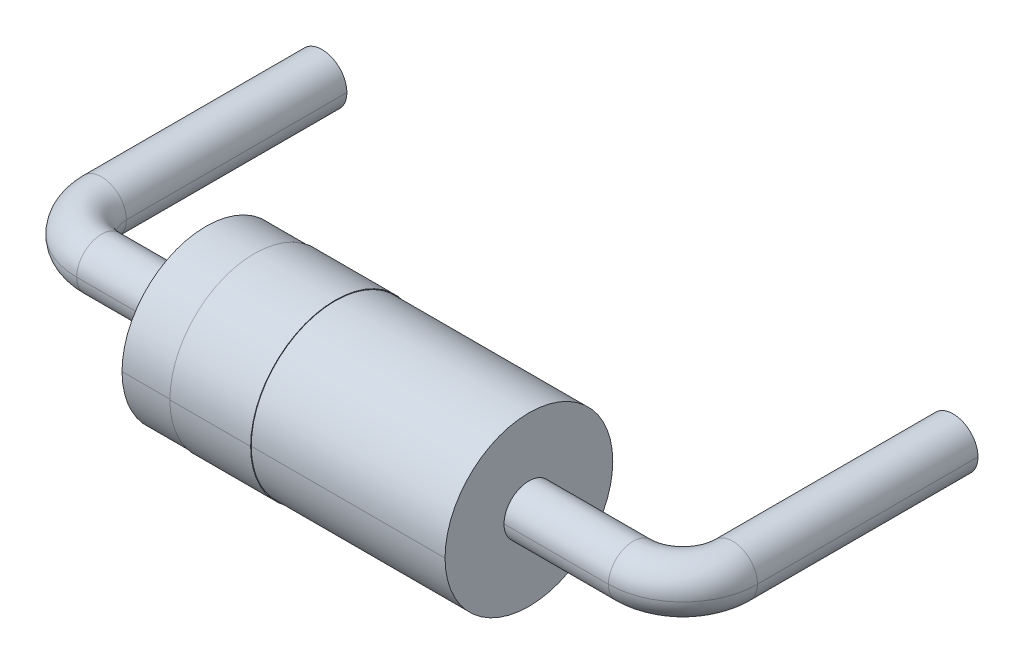
ISO-10303-21;
HEADER;
FILE_DESCRIPTION(('STEP AP214'),'2;1');
FILE_NAME('part.step','',(''),(''),'','','');
FILE_SCHEMA(('AUTOMOTIVE_DESIGN { 1 0 10303 214 1 1 1 1 }'));
ENDSEC;
DATA;
#1=APPLICATION_CONTEXT('core data for automotive mechanical design processes');
#2=APPLICATION_PROTOCOL_DEFINITION('international standard','automotive_design',2000,#1);
#3=PRODUCT_CONTEXT('',#1,'mechanical');
#4=PRODUCT('Part','Part','',(#3));
#5=PRODUCT_RELATED_PRODUCT_CATEGORY('part','',(#4));
#6=PRODUCT_DEFINITION_FORMATION('','',#4);
#7=PRODUCT_DEFINITION_CONTEXT('part definition',#1,'design');
#8=PRODUCT_DEFINITION('design','',#6,#7);
#9=PRODUCT_DEFINITION_SHAPE('','',#8);
#10=(LENGTH_UNIT() NAMED_UNIT(*) SI_UNIT(.MILLI.,.METRE.));
#11=(NAMED_UNIT(*) PLANE_ANGLE_UNIT() SI_UNIT($,.RADIAN.));
#12=(NAMED_UNIT(*) SI_UNIT($,.STERADIAN.) SOLID_ANGLE_UNIT());
#13=UNCERTAINTY_MEASURE_WITH_UNIT(LENGTH_MEASURE(1.E-05),#10,'distance_accuracy_value','');
#14=(GEOMETRIC_REPRESENTATION_CONTEXT(3) GLOBAL_UNCERTAINTY_ASSIGNED_CONTEXT((#13)) GLOBAL_UNIT_ASSIGNED_CONTEXT((#10,
#11,#12)) REPRESENTATION_CONTEXT('',''));
#15=CARTESIAN_POINT('',(0.,0.,0.));
#16=DIRECTION('',(0.,0.,1.));
#17=DIRECTION('',(1.,0.,0.));
#18=AXIS2_PLACEMENT_3D('',#15,#16,#17);
#19=CARTESIAN_POINT('',(3.26,0.,1.85));
#20=DIRECTION('',(1.,0.,0.));
#21=DIRECTION('',(0.,0.,1.));
#22=AXIS2_PLACEMENT_3D('',#19,#20,#21);
#23=CYLINDRICAL_SURFACE('',#22,1.36);
#24=DIRECTION('',(1.,0.,0.));
#25=VECTOR('',#24,1.);
#26=CARTESIAN_POINT('',(3.26,0.,0.49));
#27=LINE('',#26,#25);
#28=CARTESIAN_POINT('',(3.26,0.,0.49));
#29=VERTEX_POINT('',#28);
#30=CARTESIAN_POINT('',(4.56,0.,0.49));
#31=VERTEX_POINT('',#30);
#32=EDGE_CURVE('E314',#29,#31,#27,.T.);
#33=ORIENTED_EDGE('',*,*,#32,.F.);
#34=CARTESIAN_POINT('',(3.26,0.,1.85));
#35=DIRECTION('',(1.,0.,0.));
#36=DIRECTION('',(0.,0.,1.));
#37=AXIS2_PLACEMENT_3D('',#34,#35,#36);
#38=CIRCLE('',#37,1.36);
#39=CARTESIAN_POINT('',(3.26,0.,3.21));
#40=VERTEX_POINT('',#39);
#41=EDGE_CURVE('E11',#29,#40,#38,.T.);
#42=ORIENTED_EDGE('',*,*,#41,.T.);
#43=DIRECTION('',(1.,0.,0.));
#44=VECTOR('',#43,1.);
#45=CARTESIAN_POINT('',(3.26,0.,3.21));
#46=LINE('',#45,#44);
#47=CARTESIAN_POINT('',(4.56,0.,3.21));
#48=VERTEX_POINT('',#47);
#49=EDGE_CURVE('E169',#40,#48,#46,.T.);
#50=ORIENTED_EDGE('',*,*,#49,.T.);
#51=CARTESIAN_POINT('',(4.56,0.,1.85));
#52=DIRECTION('',(1.,0.,0.));
#53=DIRECTION('',(0.,0.,1.));
#54=AXIS2_PLACEMENT_3D('',#51,#52,#53);
#55=CIRCLE('',#54,1.36);
#56=EDGE_CURVE('E27',#31,#48,#55,.T.);
#57=ORIENTED_EDGE('',*,*,#56,.F.);
#58=EDGE_LOOP('',(#33,#42,#50,#57));
#59=FACE_BOUND('',#58,.T.);
#60=ADVANCED_FACE('F16',(#59),#23,.T.);
#61=CARTESIAN_POINT('',(3.26,0.,1.85));
#62=DIRECTION('',(1.,0.,0.));
#63=DIRECTION('',(0.,1.,0.));
#64=AXIS2_PLACEMENT_3D('',#61,#62,#63);
#65=PLANE('',#64);
#66=CARTESIAN_POINT('',(3.26,0.,1.85));
#67=DIRECTION('',(1.,0.,0.));
#68=DIRECTION('',(0.,0.,1.));
#69=AXIS2_PLACEMENT_3D('',#66,#67,#68);
#70=CIRCLE('',#69,1.35);
#71=CARTESIAN_POINT('',(3.26,0.,3.2));
#72=VERTEX_POINT('',#71);
#73=CARTESIAN_POINT('',(3.26,0.,0.5));
#74=VERTEX_POINT('',#73);
#75=EDGE_CURVE('E165',#72,#74,#70,.T.);
#76=ORIENTED_EDGE('',*,*,#75,.T.);
#77=CARTESIAN_POINT('',(3.26,0.,1.85));
#78=DIRECTION('',(1.,0.,0.));
#79=DIRECTION('',(0.,0.,1.));
#80=AXIS2_PLACEMENT_3D('',#77,#78,#79);
#81=CIRCLE('',#80,1.35);
#82=EDGE_CURVE('E160',#74,#72,#81,.T.);
#83=ORIENTED_EDGE('',*,*,#82,.T.);
#84=EDGE_LOOP('',(#76,#83));
#85=FACE_BOUND('',#84,.T.);
#86=CARTESIAN_POINT('',(3.26,0.,1.85));
#87=DIRECTION('',(1.,0.,0.));
#88=DIRECTION('',(0.,0.,1.));
#89=AXIS2_PLACEMENT_3D('',#86,#87,#88);
#90=CIRCLE('',#89,1.36);
#91=EDGE_CURVE('E232',#40,#29,#90,.T.);
#92=ORIENTED_EDGE('',*,*,#91,.F.);
#93=ORIENTED_EDGE('',*,*,#41,.F.);
#94=EDGE_LOOP('',(#92,#93));
#95=FACE_BOUND('',#94,.T.);
#96=ADVANCED_FACE('F351',(#85,#95),#65,.F.);
#97=CARTESIAN_POINT('',(4.56,0.,1.85));
#98=DIRECTION('',(1.,0.,0.));
#99=DIRECTION('',(0.,1.,0.));
#100=AXIS2_PLACEMENT_3D('',#97,#98,#99);
#101=PLANE('',#100);
#102=CARTESIAN_POINT('',(4.56,0.,1.85));
#103=DIRECTION('',(1.,0.,0.));
#104=DIRECTION('',(0.,0.,1.));
#105=AXIS2_PLACEMENT_3D('',#102,#103,#104);
#106=CIRCLE('',#105,1.35);
#107=CARTESIAN_POINT('',(4.56,0.,3.2));
#108=VERTEX_POINT('',#107);
#109=CARTESIAN_POINT('',(4.56,0.,0.5));
#110=VERTEX_POINT('',#109);
#111=EDGE_CURVE('E215',#108,#110,#106,.T.);
#112=ORIENTED_EDGE('',*,*,#111,.F.);
#113=CARTESIAN_POINT('',(4.56,0.,1.85));
#114=DIRECTION('',(1.,0.,0.));
#115=DIRECTION('',(0.,0.,1.));
#116=AXIS2_PLACEMENT_3D('',#113,#114,#115);
#117=CIRCLE('',#116,1.35);
#118=EDGE_CURVE('E155',#110,#108,#117,.T.);
#119=ORIENTED_EDGE('',*,*,#118,.F.);
#120=EDGE_LOOP('',(#112,#119));
#121=FACE_BOUND('',#120,.T.);
#122=CARTESIAN_POINT('',(4.56,0.,1.85));
#123=DIRECTION('',(1.,0.,0.));
#124=DIRECTION('',(0.,0.,1.));
#125=AXIS2_PLACEMENT_3D('',#122,#123,#124);
#126=CIRCLE('',#125,1.36);
#127=EDGE_CURVE('E175',#48,#31,#126,.T.);
#128=ORIENTED_EDGE('',*,*,#127,.T.);
#129=ORIENTED_EDGE('',*,*,#56,.T.);
#130=EDGE_LOOP('',(#128,#129));
#131=FACE_BOUND('',#130,.T.);
#132=ADVANCED_FACE('F347',(#121,#131),#101,.T.);
#133=CARTESIAN_POINT('',(2.48,0.,1.85));
#134=DIRECTION('',(1.,0.,0.));
#135=DIRECTION('',(0.,0.,1.));
#136=AXIS2_PLACEMENT_3D('',#133,#134,#135);
#137=CYLINDRICAL_SURFACE('',#136,1.35);
#138=DIRECTION('',(1.,0.,0.));
#139=VECTOR('',#138,1.);
#140=CARTESIAN_POINT('',(2.48,0.,0.5));
#141=LINE('',#140,#139);
#142=CARTESIAN_POINT('',(2.48,0.,0.5));
#143=VERTEX_POINT('',#142);
#144=EDGE_CURVE('E20',#143,#74,#141,.T.);
#145=ORIENTED_EDGE('',*,*,#144,.F.);
#146=CARTESIAN_POINT('',(2.48,0.,1.85));
#147=DIRECTION('',(1.,0.,0.));
#148=DIRECTION('',(0.,0.,1.));
#149=AXIS2_PLACEMENT_3D('',#146,#147,#148);
#150=CIRCLE('',#149,1.35);
#151=CARTESIAN_POINT('',(2.48,0.,3.2));
#152=VERTEX_POINT('',#151);
#153=EDGE_CURVE('E146',#143,#152,#150,.T.);
#154=ORIENTED_EDGE('',*,*,#153,.T.);
#155=DIRECTION('',(1.,0.,0.));
#156=VECTOR('',#155,1.);
#157=CARTESIAN_POINT('',(2.48,0.,3.2));
#158=LINE('',#157,#156);
#159=EDGE_CURVE('E167',#152,#72,#158,.T.);
#160=ORIENTED_EDGE('',*,*,#159,.T.);
#161=ORIENTED_EDGE('',*,*,#82,.F.);
#162=EDGE_LOOP('',(#145,#154,#160,#161));
#163=FACE_BOUND('',#162,.T.);
#164=ADVANCED_FACE('F159',(#163),#137,.T.);
#165=CARTESIAN_POINT('',(2.48,0.,1.85));
#166=DIRECTION('',(1.,0.,0.));
#167=DIRECTION('',(0.,0.,1.));
#168=AXIS2_PLACEMENT_3D('',#165,#166,#167);
#169=CYLINDRICAL_SURFACE('',#168,1.35);
#170=DIRECTION('',(1.,0.,0.));
#171=VECTOR('',#170,1.);
#172=CARTESIAN_POINT('',(2.48,0.,0.5));
#173=LINE('',#172,#171);
#174=CARTESIAN_POINT('',(7.68,0.,0.5));
#175=VERTEX_POINT('',#174);
#176=EDGE_CURVE('E219',#110,#175,#173,.T.);
#177=ORIENTED_EDGE('',*,*,#176,.F.);
#178=ORIENTED_EDGE('',*,*,#118,.T.);
#179=DIRECTION('',(1.,0.,0.));
#180=VECTOR('',#179,1.);
#181=CARTESIAN_POINT('',(2.48,0.,3.2));
#182=LINE('',#181,#180);
#183=CARTESIAN_POINT('',(7.68,0.,3.2));
#184=VERTEX_POINT('',#183);
#185=EDGE_CURVE('E236',#108,#184,#182,.T.);
#186=ORIENTED_EDGE('',*,*,#185,.T.);
#187=CARTESIAN_POINT('',(7.68,0.,1.85));
#188=DIRECTION('',(1.,0.,0.));
#189=DIRECTION('',(0.,0.,1.));
#190=AXIS2_PLACEMENT_3D('',#187,#188,#189);
#191=CIRCLE('',#190,1.35);
#192=EDGE_CURVE('E156',#175,#184,#191,.T.);
#193=ORIENTED_EDGE('',*,*,#192,.F.);
#194=EDGE_LOOP('',(#177,#178,#186,#193));
#195=FACE_BOUND('',#194,.T.);
#196=ADVANCED_FACE('F390',(#195),#169,.T.);
#197=CARTESIAN_POINT('',(2.48,0.,1.85));
#198=DIRECTION('',(1.,0.,0.));
#199=DIRECTION('',(0.,1.,0.));
#200=AXIS2_PLACEMENT_3D('',#197,#198,#199);
#201=PLANE('',#200);
#202=CARTESIAN_POINT('',(2.48,0.,1.85));
#203=DIRECTION('',(1.,0.,0.));
#204=DIRECTION('',(0.,0.,-1.));
#205=AXIS2_PLACEMENT_3D('',#202,#203,#204);
#206=CIRCLE('',#205,0.4);
#207=CARTESIAN_POINT('',(2.48,0.,1.45));
#208=VERTEX_POINT('',#207);
#209=CARTESIAN_POINT('',(2.48,0.,2.25));
#210=VERTEX_POINT('',#209);
#211=EDGE_CURVE('E220',#208,#210,#206,.T.);
#212=ORIENTED_EDGE('',*,*,#211,.T.);
#213=CARTESIAN_POINT('',(2.48,0.,1.85));
#214=DIRECTION('',(1.,0.,0.));
#215=DIRECTION('',(0.,0.,-1.));
#216=AXIS2_PLACEMENT_3D('',#213,#214,#215);
#217=CIRCLE('',#216,0.4);
#218=EDGE_CURVE('E278',#210,#208,#217,.T.);
#219=ORIENTED_EDGE('',*,*,#218,.T.);
#220=EDGE_LOOP('',(#212,#219));
#221=FACE_BOUND('',#220,.T.);
#222=CARTESIAN_POINT('',(2.48,0.,1.85));
#223=DIRECTION('',(1.,0.,0.));
#224=DIRECTION('',(0.,0.,1.));
#225=AXIS2_PLACEMENT_3D('',#222,#223,#224);
#226=CIRCLE('',#225,1.35);
#227=EDGE_CURVE('E150',#152,#143,#226,.T.);
#228=ORIENTED_EDGE('',*,*,#227,.F.);
#229=ORIENTED_EDGE('',*,*,#153,.F.);
#230=EDGE_LOOP('',(#228,#229));
#231=FACE_BOUND('',#230,.T.);
#232=ADVANCED_FACE('F148',(#221,#231),#201,.F.);
#233=CARTESIAN_POINT('',(7.68,0.,1.85));
#234=DIRECTION('',(1.,0.,0.));
#235=DIRECTION('',(0.,1.,0.));
#236=AXIS2_PLACEMENT_3D('',#233,#234,#235);
#237=PLANE('',#236);
#238=CARTESIAN_POINT('',(7.68,0.,1.85));
#239=DIRECTION('',(1.,0.,0.));
#240=DIRECTION('',(0.,0.,-1.));
#241=AXIS2_PLACEMENT_3D('',#238,#239,#240);
#242=CIRCLE('',#241,0.4);
#243=CARTESIAN_POINT('',(7.68,0.,1.45));
#244=VERTEX_POINT('',#243);
#245=CARTESIAN_POINT('',(7.68,0.,2.25));
#246=VERTEX_POINT('',#245);
#247=EDGE_CURVE('E210',#244,#246,#242,.T.);
#248=ORIENTED_EDGE('',*,*,#247,.F.);
#249=CARTESIAN_POINT('',(7.68,0.,1.85));
#250=DIRECTION('',(1.,0.,0.));
#251=DIRECTION('',(0.,0.,-1.));
#252=AXIS2_PLACEMENT_3D('',#249,#250,#251);
#253=CIRCLE('',#252,0.4);
#254=EDGE_CURVE('E271',#246,#244,#253,.T.);
#255=ORIENTED_EDGE('',*,*,#254,.F.);
#256=EDGE_LOOP('',(#248,#255));
#257=FACE_BOUND('',#256,.T.);
#258=CARTESIAN_POINT('',(7.68,0.,1.85));
#259=DIRECTION('',(1.,0.,0.));
#260=DIRECTION('',(0.,0.,1.));
#261=AXIS2_PLACEMENT_3D('',#258,#259,#260);
#262=CIRCLE('',#261,1.35);
#263=EDGE_CURVE('E240',#184,#175,#262,.T.);
#264=ORIENTED_EDGE('',*,*,#263,.T.);
#265=ORIENTED_EDGE('',*,*,#192,.T.);
#266=EDGE_LOOP('',(#264,#265));
#267=FACE_BOUND('',#266,.T.);
#268=ADVANCED_FACE('F411',(#257,#267),#237,.T.);
#269=CARTESIAN_POINT('',(0.8,0.,1.85));
#270=DIRECTION('',(1.,0.,0.));
#271=DIRECTION('',(0.,0.,-1.));
#272=AXIS2_PLACEMENT_3D('',#269,#270,#271);
#273=CYLINDRICAL_SURFACE('',#272,0.4);
#274=DIRECTION('',(1.,0.,0.));
#275=VECTOR('',#274,1.);
#276=CARTESIAN_POINT('',(0.8,0.,2.25));
#277=LINE('',#276,#275);
#278=CARTESIAN_POINT('',(0.8,0.,2.25));
#279=VERTEX_POINT('',#278);
#280=EDGE_CURVE('E225',#279,#210,#277,.T.);
#281=ORIENTED_EDGE('',*,*,#280,.F.);
#282=CARTESIAN_POINT('',(0.8,0.,1.85));
#283=DIRECTION('',(-1.,0.,0.));
#284=DIRECTION('',(0.,0.,1.));
#285=AXIS2_PLACEMENT_3D('',#282,#283,#284);
#286=CIRCLE('',#285,0.4);
#287=CARTESIAN_POINT('',(0.8,0.,1.45));
#288=VERTEX_POINT('',#287);
#289=EDGE_CURVE('E265',#288,#279,#286,.T.);
#290=ORIENTED_EDGE('',*,*,#289,.F.);
#291=DIRECTION('',(1.,0.,0.));
#292=VECTOR('',#291,1.);
#293=CARTESIAN_POINT('',(0.8,0.,1.45));
#294=LINE('',#293,#292);
#295=EDGE_CURVE('E224',#288,#208,#294,.T.);
#296=ORIENTED_EDGE('',*,*,#295,.T.);
#297=ORIENTED_EDGE('',*,*,#218,.F.);
#298=EDGE_LOOP('',(#281,#290,#296,#297));
#299=FACE_BOUND('',#298,.T.);
#300=ADVANCED_FACE('F276',(#299),#273,.T.);
#301=CARTESIAN_POINT('',(0.8,0.,1.85));
#302=DIRECTION('',(1.,0.,0.));
#303=DIRECTION('',(0.,0.,-1.));
#304=AXIS2_PLACEMENT_3D('',#301,#302,#303);
#305=CYLINDRICAL_SURFACE('',#304,0.4);
#306=DIRECTION('',(1.,0.,0.));
#307=VECTOR('',#306,1.);
#308=CARTESIAN_POINT('',(0.8,0.,2.25));
#309=LINE('',#308,#307);
#310=CARTESIAN_POINT('',(9.36,0.,2.25));
#311=VERTEX_POINT('',#310);
#312=EDGE_CURVE('E205',#246,#311,#309,.T.);
#313=ORIENTED_EDGE('',*,*,#312,.F.);
#314=ORIENTED_EDGE('',*,*,#254,.T.);
#315=DIRECTION('',(1.,0.,0.));
#316=VECTOR('',#315,1.);
#317=CARTESIAN_POINT('',(0.8,0.,1.45));
#318=LINE('',#317,#316);
#319=CARTESIAN_POINT('',(9.36,0.,1.45));
#320=VERTEX_POINT('',#319);
#321=EDGE_CURVE('E209',#244,#320,#318,.T.);
#322=ORIENTED_EDGE('',*,*,#321,.T.);
#323=CARTESIAN_POINT('',(9.36,0.,1.85));
#324=DIRECTION('',(1.,0.,0.));
#325=DIRECTION('',(0.,0.,-1.));
#326=AXIS2_PLACEMENT_3D('',#323,#324,#325);
#327=CIRCLE('',#326,0.4);
#328=EDGE_CURVE('E272',#311,#320,#327,.T.);
#329=ORIENTED_EDGE('',*,*,#328,.F.);
#330=EDGE_LOOP('',(#313,#314,#322,#329));
#331=FACE_BOUND('',#330,.T.);
#332=ADVANCED_FACE('F18',(#331),#305,.T.);
#333=CARTESIAN_POINT('',(0.8,0.,1.05));
#334=DIRECTION('',(0.,1.,0.));
#335=DIRECTION('',(1.,0.,0.));
#336=AXIS2_PLACEMENT_3D('',#333,#334,#335);
#337=TOROIDAL_SURFACE('',#336,0.8,0.4);
#338=CARTESIAN_POINT('',(0.8,0.,1.05));
#339=DIRECTION('',(0.,1.,0.));
#340=DIRECTION('',(0.,0.,1.));
#341=AXIS2_PLACEMENT_3D('',#338,#339,#340);
#342=CIRCLE('',#341,1.2);
#343=CARTESIAN_POINT('',(-0.4,0.,1.05));
#344=VERTEX_POINT('',#343);
#345=EDGE_CURVE('E193',#344,#279,#342,.T.);
#346=ORIENTED_EDGE('',*,*,#345,.F.);
#347=CARTESIAN_POINT('',(0.,0.,1.05));
#348=DIRECTION('',(0.,0.,1.));
#349=DIRECTION('',(1.,0.,0.));
#350=AXIS2_PLACEMENT_3D('',#347,#348,#349);
#351=CIRCLE('',#350,0.4);
#352=CARTESIAN_POINT('',(0.4,0.,1.05));
#353=VERTEX_POINT('',#352);
#354=EDGE_CURVE('E264',#344,#353,#351,.T.);
#355=ORIENTED_EDGE('',*,*,#354,.T.);
#356=CARTESIAN_POINT('',(0.8,0.,1.05));
#357=DIRECTION('',(0.,1.,0.));
#358=DIRECTION('',(0.,0.,1.));
#359=AXIS2_PLACEMENT_3D('',#356,#357,#358);
#360=CIRCLE('',#359,0.4);
#361=EDGE_CURVE('E254',#353,#288,#360,.T.);
#362=ORIENTED_EDGE('',*,*,#361,.T.);
#363=ORIENTED_EDGE('',*,*,#289,.T.);
#364=EDGE_LOOP('',(#346,#355,#362,#363));
#365=FACE_BOUND('',#364,.T.);
#366=ADVANCED_FACE('F263',(#365),#337,.T.);
#367=CARTESIAN_POINT('',(9.36,0.,1.05));
#368=DIRECTION('',(0.,1.,0.));
#369=DIRECTION('',(1.,0.,0.));
#370=AXIS2_PLACEMENT_3D('',#367,#368,#369);
#371=TOROIDAL_SURFACE('',#370,0.8,0.4);
#372=CARTESIAN_POINT('',(9.36,0.,1.05));
#373=DIRECTION('',(0.,1.,0.));
#374=DIRECTION('',(0.,0.,1.));
#375=AXIS2_PLACEMENT_3D('',#372,#373,#374);
#376=CIRCLE('',#375,1.2);
#377=CARTESIAN_POINT('',(10.56,0.,1.05));
#378=VERTEX_POINT('',#377);
#379=EDGE_CURVE('E204',#311,#378,#376,.T.);
#380=ORIENTED_EDGE('',*,*,#379,.F.);
#381=ORIENTED_EDGE('',*,*,#328,.T.);
#382=CARTESIAN_POINT('',(9.36,0.,1.05));
#383=DIRECTION('',(0.,1.,0.));
#384=DIRECTION('',(0.,0.,1.));
#385=AXIS2_PLACEMENT_3D('',#382,#383,#384);
#386=CIRCLE('',#385,0.4);
#387=CARTESIAN_POINT('',(9.76,0.,1.05));
#388=VERTEX_POINT('',#387);
#389=EDGE_CURVE('E203',#320,#388,#386,.T.);
#390=ORIENTED_EDGE('',*,*,#389,.T.);
#391=CARTESIAN_POINT('',(10.16,0.,1.05));
#392=DIRECTION('',(0.,0.,1.));
#393=DIRECTION('',(1.,0.,0.));
#394=AXIS2_PLACEMENT_3D('',#391,#392,#393);
#395=CIRCLE('',#394,0.4);
#396=EDGE_CURVE('E298',#388,#378,#395,.T.);
#397=ORIENTED_EDGE('',*,*,#396,.T.);
#398=EDGE_LOOP('',(#380,#381,#390,#397));
#399=FACE_BOUND('',#398,.T.);
#400=ADVANCED_FACE('F389',(#399),#371,.T.);
#401=CARTESIAN_POINT('',(0.,0.,1.05));
#402=DIRECTION('',(0.,0.,1.));
#403=DIRECTION('',(1.,0.,0.));
#404=AXIS2_PLACEMENT_3D('',#401,#402,#403);
#405=CYLINDRICAL_SURFACE('',#404,0.4);
#406=DIRECTION('',(0.,0.,1.));
#407=VECTOR('',#406,1.);
#408=CARTESIAN_POINT('',(-0.4,0.,1.05));
#409=LINE('',#408,#407);
#410=CARTESIAN_POINT('',(-0.4,0.,-2.5));
#411=VERTEX_POINT('',#410);
#412=EDGE_CURVE('E183',#411,#344,#409,.T.);
#413=ORIENTED_EDGE('',*,*,#412,.F.);
#414=CARTESIAN_POINT('',(0.,0.,-2.5));
#415=DIRECTION('',(0.,0.,1.));
#416=DIRECTION('',(1.,0.,0.));
#417=AXIS2_PLACEMENT_3D('',#414,#415,#416);
#418=CIRCLE('',#417,0.4);
#419=CARTESIAN_POINT('',(0.4,0.,-2.5));
#420=VERTEX_POINT('',#419);
#421=EDGE_CURVE('E291',#411,#420,#418,.T.);
#422=ORIENTED_EDGE('',*,*,#421,.T.);
#423=DIRECTION('',(0.,0.,1.));
#424=VECTOR('',#423,1.);
#425=CARTESIAN_POINT('',(0.4,0.,1.05));
#426=LINE('',#425,#424);
#427=EDGE_CURVE('E179',#420,#353,#426,.T.);
#428=ORIENTED_EDGE('',*,*,#427,.T.);
#429=ORIENTED_EDGE('',*,*,#354,.F.);
#430=EDGE_LOOP('',(#413,#422,#428,#429));
#431=FACE_BOUND('',#430,.T.);
#432=ADVANCED_FACE('F408',(#431),#405,.T.);
#433=CARTESIAN_POINT('',(10.16,0.,1.05));
#434=DIRECTION('',(0.,0.,-1.));
#435=DIRECTION('',(-1.,0.,0.));
#436=AXIS2_PLACEMENT_3D('',#433,#434,#435);
#437=CYLINDRICAL_SURFACE('',#436,0.4);
#438=DIRECTION('',(0.,0.,-1.));
#439=VECTOR('',#438,1.);
#440=CARTESIAN_POINT('',(10.56,0.,1.05));
#441=LINE('',#440,#439);
#442=CARTESIAN_POINT('',(10.56,0.,-2.5));
#443=VERTEX_POINT('',#442);
#444=EDGE_CURVE('E182',#378,#443,#441,.T.);
#445=ORIENTED_EDGE('',*,*,#444,.F.);
#446=ORIENTED_EDGE('',*,*,#396,.F.);
#447=DIRECTION('',(0.,0.,-1.));
#448=VECTOR('',#447,1.);
#449=CARTESIAN_POINT('',(9.76,0.,1.05));
#450=LINE('',#449,#448);
#451=CARTESIAN_POINT('',(9.76,0.,-2.5));
#452=VERTEX_POINT('',#451);
#453=EDGE_CURVE('E211',#388,#452,#450,.T.);
#454=ORIENTED_EDGE('',*,*,#453,.T.);
#455=CARTESIAN_POINT('',(10.16,0.,-2.5));
#456=DIRECTION('',(0.,0.,-1.));
#457=DIRECTION('',(-1.,0.,0.));
#458=AXIS2_PLACEMENT_3D('',#455,#456,#457);
#459=CIRCLE('',#458,0.4);
#460=EDGE_CURVE('E41',#443,#452,#459,.T.);
#461=ORIENTED_EDGE('',*,*,#460,.F.);
#462=EDGE_LOOP('',(#445,#446,#454,#461));
#463=FACE_BOUND('',#462,.T.);
#464=ADVANCED_FACE('F385',(#463),#437,.T.);
#465=CARTESIAN_POINT('',(0.4,0.,-2.5));
#466=DIRECTION('',(0.,0.,-1.));
#467=DIRECTION('',(0.,-1.,0.));
#468=AXIS2_PLACEMENT_3D('',#465,#466,#467);
#469=PLANE('',#468);
#470=CARTESIAN_POINT('',(0.,0.,-2.5));
#471=DIRECTION('',(0.,0.,1.));
#472=DIRECTION('',(1.,0.,0.));
#473=AXIS2_PLACEMENT_3D('',#470,#471,#472);
#474=CIRCLE('',#473,0.4);
#475=EDGE_CURVE('E192',#420,#411,#474,.T.);
#476=ORIENTED_EDGE('',*,*,#475,.F.);
#477=ORIENTED_EDGE('',*,*,#421,.F.);
#478=EDGE_LOOP('',(#476,#477));
#479=FACE_BOUND('',#478,.T.);
#480=ADVANCED_FACE('F376',(#479),#469,.T.);
#481=CARTESIAN_POINT('',(9.76,0.,-2.5));
#482=DIRECTION('',(0.,0.,1.));
#483=DIRECTION('',(1.,0.,0.));
#484=AXIS2_PLACEMENT_3D('',#481,#482,#483);
#485=PLANE('',#484);
#486=CARTESIAN_POINT('',(10.16,0.,-2.5));
#487=DIRECTION('',(0.,0.,-1.));
#488=DIRECTION('',(-1.,0.,0.));
#489=AXIS2_PLACEMENT_3D('',#486,#487,#488);
#490=CIRCLE('',#489,0.4);
#491=EDGE_CURVE('E214',#452,#443,#490,.T.);
#492=ORIENTED_EDGE('',*,*,#491,.T.);
#493=ORIENTED_EDGE('',*,*,#460,.T.);
#494=EDGE_LOOP('',(#492,#493));
#495=FACE_BOUND('',#494,.T.);
#496=ADVANCED_FACE('F372',(#495),#485,.F.);
#497=CARTESIAN_POINT('',(10.16,0.,1.05));
#498=DIRECTION('',(0.,0.,-1.));
#499=DIRECTION('',(-1.,0.,0.));
#500=AXIS2_PLACEMENT_3D('',#497,#498,#499);
#501=CYLINDRICAL_SURFACE('',#500,0.4);
#502=CARTESIAN_POINT('',(10.16,0.,1.05));
#503=DIRECTION('',(0.,0.,1.));
#504=DIRECTION('',(1.,0.,0.));
#505=AXIS2_PLACEMENT_3D('',#502,#503,#504);
#506=CIRCLE('',#505,0.4);
#507=EDGE_CURVE('E199',#378,#388,#506,.T.);
#508=ORIENTED_EDGE('',*,*,#507,.F.);
#509=ORIENTED_EDGE('',*,*,#444,.T.);
#510=ORIENTED_EDGE('',*,*,#491,.F.);
#511=ORIENTED_EDGE('',*,*,#453,.F.);
#512=EDGE_LOOP('',(#508,#509,#510,#511));
#513=FACE_BOUND('',#512,.T.);
#514=ADVANCED_FACE('F375',(#513),#501,.T.);
#515=CARTESIAN_POINT('',(0.,0.,1.05));
#516=DIRECTION('',(0.,0.,1.));
#517=DIRECTION('',(1.,0.,0.));
#518=AXIS2_PLACEMENT_3D('',#515,#516,#517);
#519=CYLINDRICAL_SURFACE('',#518,0.4);
#520=ORIENTED_EDGE('',*,*,#475,.T.);
#521=ORIENTED_EDGE('',*,*,#412,.T.);
#522=CARTESIAN_POINT('',(0.,0.,1.05));
#523=DIRECTION('',(0.,0.,1.));
#524=DIRECTION('',(1.,0.,0.));
#525=AXIS2_PLACEMENT_3D('',#522,#523,#524);
#526=CIRCLE('',#525,0.4);
#527=EDGE_CURVE('E198',#353,#344,#526,.T.);
#528=ORIENTED_EDGE('',*,*,#527,.F.);
#529=ORIENTED_EDGE('',*,*,#427,.F.);
#530=EDGE_LOOP('',(#520,#521,#528,#529));
#531=FACE_BOUND('',#530,.T.);
#532=ADVANCED_FACE('F258',(#531),#519,.T.);
#533=CARTESIAN_POINT('',(0.8,0.,1.85));
#534=DIRECTION('',(1.,0.,0.));
#535=DIRECTION('',(0.,0.,-1.));
#536=AXIS2_PLACEMENT_3D('',#533,#534,#535);
#537=CYLINDRICAL_SURFACE('',#536,0.4);
#538=ORIENTED_EDGE('',*,*,#247,.T.);
#539=ORIENTED_EDGE('',*,*,#312,.T.);
#540=CARTESIAN_POINT('',(9.36,0.,1.85));
#541=DIRECTION('',(1.,0.,0.));
#542=DIRECTION('',(0.,0.,-1.));
#543=AXIS2_PLACEMENT_3D('',#540,#541,#542);
#544=CIRCLE('',#543,0.4);
#545=EDGE_CURVE('E287',#320,#311,#544,.T.);
#546=ORIENTED_EDGE('',*,*,#545,.F.);
#547=ORIENTED_EDGE('',*,*,#321,.F.);
#548=EDGE_LOOP('',(#538,#539,#546,#547));
#549=FACE_BOUND('',#548,.T.);
#550=ADVANCED_FACE('F371',(#549),#537,.T.);
#551=CARTESIAN_POINT('',(0.8,0.,1.85));
#552=DIRECTION('',(1.,0.,0.));
#553=DIRECTION('',(0.,0.,-1.));
#554=AXIS2_PLACEMENT_3D('',#551,#552,#553);
#555=CYLINDRICAL_SURFACE('',#554,0.4);
#556=CARTESIAN_POINT('',(0.8,0.,1.85));
#557=DIRECTION('',(-1.,0.,0.));
#558=DIRECTION('',(0.,0.,1.));
#559=AXIS2_PLACEMENT_3D('',#556,#557,#558);
#560=CIRCLE('',#559,0.4);
#561=EDGE_CURVE('E197',#279,#288,#560,.T.);
#562=ORIENTED_EDGE('',*,*,#561,.F.);
#563=ORIENTED_EDGE('',*,*,#280,.T.);
#564=ORIENTED_EDGE('',*,*,#211,.F.);
#565=ORIENTED_EDGE('',*,*,#295,.F.);
#566=EDGE_LOOP('',(#562,#563,#564,#565));
#567=FACE_BOUND('',#566,.T.);
#568=ADVANCED_FACE('F281',(#567),#555,.T.);
#569=CARTESIAN_POINT('',(2.48,0.,1.85));
#570=DIRECTION('',(1.,0.,0.));
#571=DIRECTION('',(0.,0.,1.));
#572=AXIS2_PLACEMENT_3D('',#569,#570,#571);
#573=CYLINDRICAL_SURFACE('',#572,1.35);
#574=ORIENTED_EDGE('',*,*,#111,.T.);
#575=ORIENTED_EDGE('',*,*,#176,.T.);
#576=ORIENTED_EDGE('',*,*,#263,.F.);
#577=ORIENTED_EDGE('',*,*,#185,.F.);
#578=EDGE_LOOP('',(#574,#575,#576,#577));
#579=FACE_BOUND('',#578,.T.);
#580=ADVANCED_FACE('F367',(#579),#573,.T.);
#581=CARTESIAN_POINT('',(2.48,0.,1.85));
#582=DIRECTION('',(1.,0.,0.));
#583=DIRECTION('',(0.,0.,1.));
#584=AXIS2_PLACEMENT_3D('',#581,#582,#583);
#585=CYLINDRICAL_SURFACE('',#584,1.35);
#586=ORIENTED_EDGE('',*,*,#227,.T.);
#587=ORIENTED_EDGE('',*,*,#144,.T.);
#588=ORIENTED_EDGE('',*,*,#75,.F.);
#589=ORIENTED_EDGE('',*,*,#159,.F.);
#590=EDGE_LOOP('',(#586,#587,#588,#589));
#591=FACE_BOUND('',#590,.T.);
#592=ADVANCED_FACE('F166',(#591),#585,.T.);
#593=CARTESIAN_POINT('',(3.26,0.,1.85));
#594=DIRECTION('',(1.,0.,0.));
#595=DIRECTION('',(0.,0.,1.));
#596=AXIS2_PLACEMENT_3D('',#593,#594,#595);
#597=CYLINDRICAL_SURFACE('',#596,1.36);
#598=ORIENTED_EDGE('',*,*,#91,.T.);
#599=ORIENTED_EDGE('',*,*,#32,.T.);
#600=ORIENTED_EDGE('',*,*,#127,.F.);
#601=ORIENTED_EDGE('',*,*,#49,.F.);
#602=EDGE_LOOP('',(#598,#599,#600,#601));
#603=FACE_BOUND('',#602,.T.);
#604=ADVANCED_FACE('F350',(#603),#597,.T.);
#605=CARTESIAN_POINT('',(9.36,0.,1.05));
#606=DIRECTION('',(0.,1.,0.));
#607=DIRECTION('',(1.,0.,0.));
#608=AXIS2_PLACEMENT_3D('',#605,#606,#607);
#609=TOROIDAL_SURFACE('',#608,0.8,0.4);
#610=ORIENTED_EDGE('',*,*,#545,.T.);
#611=ORIENTED_EDGE('',*,*,#379,.T.);
#612=ORIENTED_EDGE('',*,*,#507,.T.);
#613=ORIENTED_EDGE('',*,*,#389,.F.);
#614=EDGE_LOOP('',(#610,#611,#612,#613));
#615=FACE_BOUND('',#614,.T.);
#616=ADVANCED_FACE('F404',(#615),#609,.T.);
#617=CARTESIAN_POINT('',(0.8,0.,1.05));
#618=DIRECTION('',(0.,1.,0.));
#619=DIRECTION('',(1.,0.,0.));
#620=AXIS2_PLACEMENT_3D('',#617,#618,#619);
#621=TOROIDAL_SURFACE('',#620,0.8,0.4);
#622=ORIENTED_EDGE('',*,*,#527,.T.);
#623=ORIENTED_EDGE('',*,*,#345,.T.);
#624=ORIENTED_EDGE('',*,*,#561,.T.);
#625=ORIENTED_EDGE('',*,*,#361,.F.);
#626=EDGE_LOOP('',(#622,#623,#624,#625));
#627=FACE_BOUND('',#626,.T.);
#628=ADVANCED_FACE('F250',(#627),#621,.T.);
#629=CLOSED_SHELL('',(#60,#96,#132,#164,#196,#232,#268,#300,#332,#366,#400,#432,#464,#480,#496,
#514,#532,#550,#568,#580,#592,#604,#616,#628));
#630=MANIFOLD_SOLID_BREP('B1',#629);
#631=ADVANCED_BREP_SHAPE_REPRESENTATION('',(#18,#630),#14);
#632=SHAPE_DEFINITION_REPRESENTATION(#9,#631);
ENDSEC;
END-ISO-10303-21;
